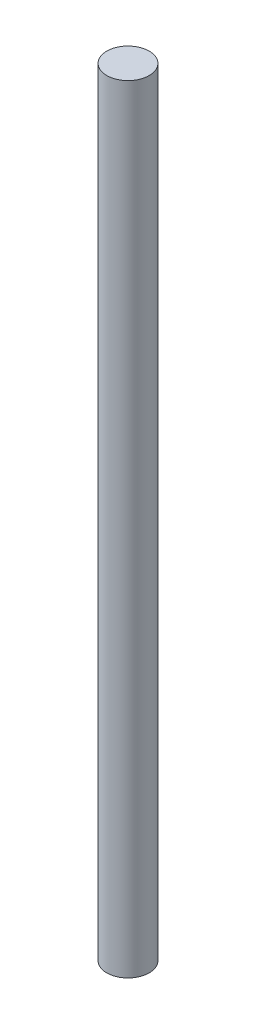
ISO-10303-21;
HEADER;
FILE_DESCRIPTION(('STEP AP214'),'2;1');
FILE_NAME('part.step','',(''),(''),'','','');
FILE_SCHEMA(('AUTOMOTIVE_DESIGN { 1 0 10303 214 1 1 1 1 }'));
ENDSEC;
DATA;
#1=APPLICATION_CONTEXT('core data for automotive mechanical design processes');
#2=APPLICATION_PROTOCOL_DEFINITION('international standard','automotive_design',2000,#1);
#3=PRODUCT_CONTEXT('',#1,'mechanical');
#4=PRODUCT('Part','Part','',(#3));
#5=PRODUCT_RELATED_PRODUCT_CATEGORY('part','',(#4));
#6=PRODUCT_DEFINITION_FORMATION('','',#4);
#7=PRODUCT_DEFINITION_CONTEXT('part definition',#1,'design');
#8=PRODUCT_DEFINITION('design','',#6,#7);
#9=PRODUCT_DEFINITION_SHAPE('','',#8);
#10=(LENGTH_UNIT() NAMED_UNIT(*) SI_UNIT(.MILLI.,.METRE.));
#11=(NAMED_UNIT(*) PLANE_ANGLE_UNIT() SI_UNIT($,.RADIAN.));
#12=(NAMED_UNIT(*) SI_UNIT($,.STERADIAN.) SOLID_ANGLE_UNIT());
#13=UNCERTAINTY_MEASURE_WITH_UNIT(LENGTH_MEASURE(1.E-05),#10,'distance_accuracy_value','');
#14=(GEOMETRIC_REPRESENTATION_CONTEXT(3) GLOBAL_UNCERTAINTY_ASSIGNED_CONTEXT((#13)) GLOBAL_UNIT_ASSIGNED_CONTEXT((#10,
#11,#12)) REPRESENTATION_CONTEXT('',''));
#15=CARTESIAN_POINT('',(0.,0.,0.));
#16=DIRECTION('',(0.,0.,1.));
#17=DIRECTION('',(1.,0.,0.));
#18=AXIS2_PLACEMENT_3D('',#15,#16,#17);
#19=CARTESIAN_POINT('',(0.,55.,0.));
#20=DIRECTION('',(0.,-1.,0.));
#21=DIRECTION('',(0.,0.,-1.));
#22=AXIS2_PLACEMENT_3D('',#19,#20,#21);
#23=CYLINDRICAL_SURFACE('',#22,3.);
#24=CARTESIAN_POINT('',(0.,55.,0.));
#25=DIRECTION('',(0.,1.,0.));
#26=DIRECTION('',(0.,0.,1.));
#27=AXIS2_PLACEMENT_3D('',#24,#25,#26);
#28=CIRCLE('',#27,3.);
#29=CARTESIAN_POINT('',(0.,55.,3.));
#30=VERTEX_POINT('',#29);
#31=EDGE_CURVE('E10',#30,#30,#28,.T.);
#32=ORIENTED_EDGE('',*,*,#31,.F.);
#33=EDGE_LOOP('',(#32));
#34=FACE_BOUND('',#33,.T.);
#35=CARTESIAN_POINT('',(0.,-55.,0.));
#36=DIRECTION('',(0.,1.,0.));
#37=DIRECTION('',(0.,0.,1.));
#38=AXIS2_PLACEMENT_3D('',#35,#36,#37);
#39=CIRCLE('',#38,3.);
#40=CARTESIAN_POINT('',(0.,-55.,3.));
#41=VERTEX_POINT('',#40);
#42=EDGE_CURVE('E36',#41,#41,#39,.T.);
#43=ORIENTED_EDGE('',*,*,#42,.T.);
#44=EDGE_LOOP('',(#43));
#45=FACE_BOUND('',#44,.T.);
#46=ADVANCED_FACE('F33',(#34,#45),#23,.T.);
#47=CARTESIAN_POINT('',(0.,55.,0.));
#48=DIRECTION('',(0.,1.,0.));
#49=DIRECTION('',(0.,0.,1.));
#50=AXIS2_PLACEMENT_3D('',#47,#48,#49);
#51=PLANE('',#50);
#52=ORIENTED_EDGE('',*,*,#31,.T.);
#53=EDGE_LOOP('',(#52));
#54=FACE_BOUND('',#53,.T.);
#55=ADVANCED_FACE('F48',(#54),#51,.T.);
#56=CARTESIAN_POINT('',(0.,-55.,0.));
#57=DIRECTION('',(0.,1.,0.));
#58=DIRECTION('',(0.,0.,1.));
#59=AXIS2_PLACEMENT_3D('',#56,#57,#58);
#60=PLANE('',#59);
#61=ORIENTED_EDGE('',*,*,#42,.F.);
#62=EDGE_LOOP('',(#61));
#63=FACE_BOUND('',#62,.T.);
#64=ADVANCED_FACE('F46',(#63),#60,.F.);
#65=CLOSED_SHELL('',(#46,#55,#64));
#66=MANIFOLD_SOLID_BREP('B2',#65);
#67=ADVANCED_BREP_SHAPE_REPRESENTATION('',(#18,#66),#14);
#68=SHAPE_DEFINITION_REPRESENTATION(#9,#67);
ENDSEC;
END-ISO-10303-21;
